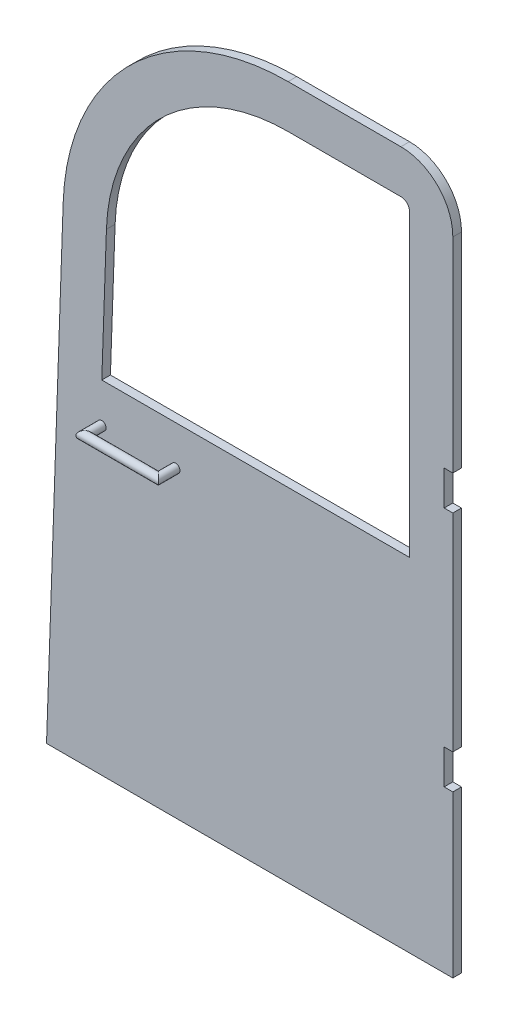
ISO-10303-21;
HEADER;
FILE_DESCRIPTION(('STEP AP214'),'2;1');
FILE_NAME('part.step','',(''),(''),'','','');
FILE_SCHEMA(('AUTOMOTIVE_DESIGN { 1 0 10303 214 1 1 1 1 }'));
ENDSEC;
DATA;
#1=APPLICATION_CONTEXT('core data for automotive mechanical design processes');
#2=APPLICATION_PROTOCOL_DEFINITION('international standard','automotive_design',2000,#1);
#3=PRODUCT_CONTEXT('',#1,'mechanical');
#4=PRODUCT('Part','Part','',(#3));
#5=PRODUCT_RELATED_PRODUCT_CATEGORY('part','',(#4));
#6=PRODUCT_DEFINITION_FORMATION('','',#4);
#7=PRODUCT_DEFINITION_CONTEXT('part definition',#1,'design');
#8=PRODUCT_DEFINITION('design','',#6,#7);
#9=PRODUCT_DEFINITION_SHAPE('','',#8);
#10=(LENGTH_UNIT() NAMED_UNIT(*) SI_UNIT(.MILLI.,.METRE.));
#11=(NAMED_UNIT(*) PLANE_ANGLE_UNIT() SI_UNIT($,.RADIAN.));
#12=(NAMED_UNIT(*) SI_UNIT($,.STERADIAN.) SOLID_ANGLE_UNIT());
#13=UNCERTAINTY_MEASURE_WITH_UNIT(LENGTH_MEASURE(1.E-05),#10,'distance_accuracy_value','');
#14=(GEOMETRIC_REPRESENTATION_CONTEXT(3) GLOBAL_UNCERTAINTY_ASSIGNED_CONTEXT((#13)) GLOBAL_UNIT_ASSIGNED_CONTEXT((#10,
#11,#12)) REPRESENTATION_CONTEXT('',''));
#15=CARTESIAN_POINT('',(0.,0.,0.));
#16=DIRECTION('',(0.,0.,1.));
#17=DIRECTION('',(1.,0.,0.));
#18=AXIS2_PLACEMENT_3D('',#15,#16,#17);
#19=CARTESIAN_POINT('',(873.874037659268,0.,25.4));
#20=DIRECTION('',(-1.,0.,0.));
#21=DIRECTION('',(0.,0.,1.));
#22=AXIS2_PLACEMENT_3D('',#19,#20,#21);
#23=PLANE('',#22);
#24=DIRECTION('',(0.,0.,1.));
#25=VECTOR('',#24,1.);
#26=CARTESIAN_POINT('',(873.874037659268,1181.70566534611,0.));
#27=LINE('',#26,#25);
#28=CARTESIAN_POINT('',(873.874037659268,1181.70566534611,0.));
#29=VERTEX_POINT('',#28);
#30=CARTESIAN_POINT('',(873.874037659268,1181.70566534611,25.4));
#31=VERTEX_POINT('',#30);
#32=EDGE_CURVE('E236',#29,#31,#27,.T.);
#33=ORIENTED_EDGE('',*,*,#32,.T.);
#34=DIRECTION('',(0.,1.,0.));
#35=VECTOR('',#34,1.);
#36=CARTESIAN_POINT('',(873.874037659268,0.,25.4));
#37=LINE('',#36,#35);
#38=CARTESIAN_POINT('',(873.874037659268,574.57159721076,25.4));
#39=VERTEX_POINT('',#38);
#40=EDGE_CURVE('E350',#39,#31,#37,.T.);
#41=ORIENTED_EDGE('',*,*,#40,.F.);
#42=DIRECTION('',(0.,0.,1.));
#43=VECTOR('',#42,1.);
#44=CARTESIAN_POINT('',(873.874037659268,574.57159721076,0.));
#45=LINE('',#44,#43);
#46=CARTESIAN_POINT('',(873.874037659268,574.57159721076,0.));
#47=VERTEX_POINT('',#46);
#48=EDGE_CURVE('E265',#47,#39,#45,.T.);
#49=ORIENTED_EDGE('',*,*,#48,.F.);
#50=DIRECTION('',(0.,1.,0.));
#51=VECTOR('',#50,1.);
#52=CARTESIAN_POINT('',(873.874037659268,0.,0.));
#53=LINE('',#52,#51);
#54=EDGE_CURVE('E371',#47,#29,#53,.T.);
#55=ORIENTED_EDGE('',*,*,#54,.T.);
#56=EDGE_LOOP('',(#33,#41,#49,#55));
#57=FACE_BOUND('',#56,.T.);
#58=ADVANCED_FACE('F51',(#57),#23,.F.);
#59=DIRECTION('',(0.,0.,1.));
#60=VECTOR('',#59,1.);
#61=CARTESIAN_POINT('',(873.874037659268,472.97159721076,0.));
#62=LINE('',#61,#60);
#63=CARTESIAN_POINT('',(873.874037659268,472.97159721076,0.));
#64=VERTEX_POINT('',#63);
#65=CARTESIAN_POINT('',(873.874037659268,472.97159721076,25.4));
#66=VERTEX_POINT('',#65);
#67=EDGE_CURVE('E268',#64,#66,#62,.T.);
#68=ORIENTED_EDGE('',*,*,#67,.T.);
#69=CARTESIAN_POINT('',(873.874037659268,0.,25.4));
#70=VERTEX_POINT('',#69);
#71=EDGE_CURVE('E345',#70,#66,#37,.T.);
#72=ORIENTED_EDGE('',*,*,#71,.F.);
#73=DIRECTION('',(0.,0.,-1.));
#74=VECTOR('',#73,1.);
#75=CARTESIAN_POINT('',(873.874037659268,0.,25.4));
#76=LINE('',#75,#74);
#77=CARTESIAN_POINT('',(873.874037659268,0.,0.));
#78=VERTEX_POINT('',#77);
#79=EDGE_CURVE('E394',#70,#78,#76,.T.);
#80=ORIENTED_EDGE('',*,*,#79,.T.);
#81=EDGE_CURVE('E366',#78,#64,#53,.T.);
#82=ORIENTED_EDGE('',*,*,#81,.T.);
#83=EDGE_LOOP('',(#68,#72,#80,#82));
#84=FACE_BOUND('',#83,.T.);
#85=ADVANCED_FACE('F418',(#84),#23,.F.);
#86=CARTESIAN_POINT('',(390.514635330888,1375.98215066507,25.4));
#87=DIRECTION('',(0.,0.,-1.));
#88=DIRECTION('',(-1.,0.,0.));
#89=AXIS2_PLACEMENT_3D('',#86,#87,#88);
#90=PLANE('',#89);
#91=CARTESIAN_POINT('',(-156.242870874206,889.,25.3999999999999));
#92=DIRECTION('',(0.,0.,-1.));
#93=DIRECTION('',(-1.,0.,0.));
#94=AXIS2_PLACEMENT_3D('',#91,#92,#93);
#95=CIRCLE('',#94,12.7);
#96=CARTESIAN_POINT('',(-168.942870874206,889.,25.3999999999999));
#97=VERTEX_POINT('',#96);
#98=EDGE_CURVE('E222',#97,#97,#95,.T.);
#99=ORIENTED_EDGE('',*,*,#98,.T.);
#100=EDGE_LOOP('',(#99));
#101=FACE_BOUND('',#100,.T.);
#102=CARTESIAN_POINT('',(60.4839734868648,889.,25.4000000000001));
#103=DIRECTION('',(0.,0.,1.));
#104=DIRECTION('',(1.,0.,0.));
#105=AXIS2_PLACEMENT_3D('',#102,#103,#104);
#106=CIRCLE('',#105,12.7);
#107=CARTESIAN_POINT('',(73.1839734868648,889.,25.4000000000001));
#108=VERTEX_POINT('',#107);
#109=EDGE_CURVE('E728',#108,#108,#106,.T.);
#110=ORIENTED_EDGE('',*,*,#109,.F.);
#111=EDGE_LOOP('',(#110));
#112=FACE_BOUND('',#111,.T.);
#113=DIRECTION('',(0.,-1.,0.));
#114=VECTOR('',#113,1.);
#115=CARTESIAN_POINT('',(848.474037659268,0.,25.4));
#116=LINE('',#115,#114);
#117=CARTESIAN_POINT('',(848.474037659268,1283.30566534611,25.4));
#118=VERTEX_POINT('',#117);
#119=CARTESIAN_POINT('',(848.474037659268,1181.70566534611,25.4));
#120=VERTEX_POINT('',#119);
#121=EDGE_CURVE('E219',#118,#120,#116,.T.);
#122=ORIENTED_EDGE('',*,*,#121,.F.);
#123=DIRECTION('',(-1.,0.,0.));
#124=VECTOR('',#123,1.);
#125=CARTESIAN_POINT('',(0.,1283.30566534611,25.4));
#126=LINE('',#125,#124);
#127=CARTESIAN_POINT('',(873.874037659268,1283.30566534611,25.4));
#128=VERTEX_POINT('',#127);
#129=EDGE_CURVE('E195',#128,#118,#126,.T.);
#130=ORIENTED_EDGE('',*,*,#129,.F.);
#131=CARTESIAN_POINT('',(873.874037659268,1883.156,25.4));
#132=VERTEX_POINT('',#131);
#133=EDGE_CURVE('E344',#128,#132,#37,.T.);
#134=ORIENTED_EDGE('',*,*,#133,.T.);
#135=CARTESIAN_POINT('',(721.476635330888,1884.04581096985,25.4));
#136=DIRECTION('',(0.,0.,1.));
#137=DIRECTION('',(1.,0.,0.));
#138=AXIS2_PLACEMENT_3D('',#135,#136,#137);
#139=CIRCLE('',#138,152.4);
#140=CARTESIAN_POINT('',(721.476635330888,2036.44581096985,25.4));
#141=VERTEX_POINT('',#140);
#142=EDGE_CURVE('E349',#132,#141,#139,.T.);
#143=ORIENTED_EDGE('',*,*,#142,.T.);
#144=DIRECTION('',(-1.,0.,0.));
#145=VECTOR('',#144,1.);
#146=CARTESIAN_POINT('',(721.476635330888,2036.44581096985,25.4));
#147=LINE('',#146,#145);
#148=CARTESIAN_POINT('',(390.514635330888,2036.44581096985,25.4));
#149=VERTEX_POINT('',#148);
#150=EDGE_CURVE('E353',#141,#149,#147,.T.);
#151=ORIENTED_EDGE('',*,*,#150,.T.);
#152=CARTESIAN_POINT('',(390.514635330888,1375.98215066507,25.4));
#153=DIRECTION('',(0.,0.,1.));
#154=DIRECTION('',(-1.,0.,0.));
#155=AXIS2_PLACEMENT_3D('',#152,#153,#154);
#156=CIRCLE('',#155,660.463660304774);
#157=CARTESIAN_POINT('',(-269.546688357159,1399.032,25.4));
#158=VERTEX_POINT('',#157);
#159=EDGE_CURVE('E356',#149,#158,#156,.T.);
#160=ORIENTED_EDGE('',*,*,#159,.T.);
#161=DIRECTION('',(-0.0348994967024969,-0.999390827019096,0.));
#162=VECTOR('',#161,1.);
#163=CARTESIAN_POINT('',(-318.401962340732,0.,25.4));
#164=LINE('',#163,#162);
#165=CARTESIAN_POINT('',(-318.401962340732,0.,25.4));
#166=VERTEX_POINT('',#165);
#167=EDGE_CURVE('E336',#158,#166,#164,.T.);
#168=ORIENTED_EDGE('',*,*,#167,.T.);
#169=DIRECTION('',(1.,0.,0.));
#170=VECTOR('',#169,1.);
#171=CARTESIAN_POINT('',(-318.401962340732,0.,25.4));
#172=LINE('',#171,#170);
#173=EDGE_CURVE('E340',#166,#70,#172,.T.);
#174=ORIENTED_EDGE('',*,*,#173,.T.);
#175=ORIENTED_EDGE('',*,*,#71,.T.);
#176=DIRECTION('',(-1.,0.,0.));
#177=VECTOR('',#176,1.);
#178=CARTESIAN_POINT('',(0.,472.97159721076,25.4));
#179=LINE('',#178,#177);
#180=CARTESIAN_POINT('',(848.474037659268,472.97159721076,25.4));
#181=VERTEX_POINT('',#180);
#182=EDGE_CURVE('E75',#66,#181,#179,.T.);
#183=ORIENTED_EDGE('',*,*,#182,.T.);
#184=DIRECTION('',(0.,1.,0.));
#185=VECTOR('',#184,1.);
#186=CARTESIAN_POINT('',(848.474037659268,0.,25.4));
#187=LINE('',#186,#185);
#188=CARTESIAN_POINT('',(848.474037659268,574.57159721076,25.4));
#189=VERTEX_POINT('',#188);
#190=EDGE_CURVE('E253',#181,#189,#187,.T.);
#191=ORIENTED_EDGE('',*,*,#190,.T.);
#192=DIRECTION('',(-1.,0.,0.));
#193=VECTOR('',#192,1.);
#194=CARTESIAN_POINT('',(0.,574.57159721076,25.4));
#195=LINE('',#194,#193);
#196=EDGE_CURVE('E245',#39,#189,#195,.T.);
#197=ORIENTED_EDGE('',*,*,#196,.F.);
#198=ORIENTED_EDGE('',*,*,#40,.T.);
#199=DIRECTION('',(-1.,0.,0.));
#200=VECTOR('',#199,1.);
#201=CARTESIAN_POINT('',(0.,1181.70566534611,25.4));
#202=LINE('',#201,#200);
#203=EDGE_CURVE('E67',#31,#120,#202,.T.);
#204=ORIENTED_EDGE('',*,*,#203,.T.);
#205=EDGE_LOOP('',(#122,#130,#134,#143,#151,#160,#168,#174,#175,#183,#191,#197,#198,#204));
#206=FACE_BOUND('',#205,.T.);
#207=CARTESIAN_POINT('',(390.514635330888,1375.98215066507,25.4));
#208=DIRECTION('',(0.,0.,1.));
#209=DIRECTION('',(-1.,0.,0.));
#210=AXIS2_PLACEMENT_3D('',#207,#208,#209);
#211=CIRCLE('',#210,533.463660304773);
#212=CARTESIAN_POINT('',(390.514635330888,1909.44581096985,25.4));
#213=VERTEX_POINT('',#212);
#214=CARTESIAN_POINT('',(-142.624053325734,1394.59976391878,25.4));
#215=VERTEX_POINT('',#214);
#216=EDGE_CURVE('E273',#213,#215,#211,.T.);
#217=ORIENTED_EDGE('',*,*,#216,.F.);
#218=DIRECTION('',(-1.,0.,0.));
#219=VECTOR('',#218,1.);
#220=CARTESIAN_POINT('',(721.476635330888,1909.44581096985,25.4));
#221=LINE('',#220,#219);
#222=CARTESIAN_POINT('',(721.476635330888,1909.44581096985,25.4));
#223=VERTEX_POINT('',#222);
#224=EDGE_CURVE('E290',#223,#213,#221,.T.);
#225=ORIENTED_EDGE('',*,*,#224,.F.);
#226=CARTESIAN_POINT('',(721.476635330888,1884.04581096985,25.4));
#227=DIRECTION('',(0.,0.,1.));
#228=DIRECTION('',(1.,0.,0.));
#229=AXIS2_PLACEMENT_3D('',#226,#227,#228);
#230=CIRCLE('',#229,25.4000000000003);
#231=CARTESIAN_POINT('',(746.874037659268,1883.68255490254,25.4));
#232=VERTEX_POINT('',#231);
#233=EDGE_CURVE('E286',#232,#223,#230,.T.);
#234=ORIENTED_EDGE('',*,*,#233,.F.);
#235=DIRECTION('',(0.,1.,0.));
#236=VECTOR('',#235,1.);
#237=CARTESIAN_POINT('',(746.874037659268,1005.34127745127,25.4));
#238=LINE('',#237,#236);
#239=CARTESIAN_POINT('',(746.874037659268,1005.34127745127,25.4));
#240=VERTEX_POINT('',#239);
#241=EDGE_CURVE('E283',#240,#232,#238,.T.);
#242=ORIENTED_EDGE('',*,*,#241,.F.);
#243=DIRECTION('',(0.999999670246038,0.000812100864935569,0.));
#244=VECTOR('',#243,1.);
#245=CARTESIAN_POINT('',(-156.242870874206,1004.60785518686,25.4));
#246=LINE('',#245,#244);
#247=CARTESIAN_POINT('',(-156.242870874206,1004.60785518686,25.4));
#248=VERTEX_POINT('',#247);
#249=EDGE_CURVE('E280',#248,#240,#246,.T.);
#250=ORIENTED_EDGE('',*,*,#249,.F.);
#251=DIRECTION('',(-0.0348994967024968,-0.999390827019096,0.));
#252=VECTOR('',#251,1.);
#253=CARTESIAN_POINT('',(-156.242870874206,1004.60785518686,25.4));
#254=LINE('',#253,#252);
#255=EDGE_CURVE('E276',#215,#248,#254,.T.);
#256=ORIENTED_EDGE('',*,*,#255,.F.);
#257=EDGE_LOOP('',(#217,#225,#234,#242,#250,#256));
#258=FACE_BOUND('',#257,.T.);
#259=ADVANCED_FACE('F409',(#101,#112,#206,#258),#90,.F.);
#260=CARTESIAN_POINT('',(390.514635330888,1375.98215066507,0.));
#261=DIRECTION('',(0.,0.,-1.));
#262=DIRECTION('',(-1.,0.,0.));
#263=AXIS2_PLACEMENT_3D('',#260,#261,#262);
#264=PLANE('',#263);
#265=CARTESIAN_POINT('',(60.4839734868648,889.,0.));
#266=DIRECTION('',(0.,0.,-1.));
#267=DIRECTION('',(-1.,0.,0.));
#268=AXIS2_PLACEMENT_3D('',#265,#266,#267);
#269=CIRCLE('',#268,12.7);
#270=CARTESIAN_POINT('',(47.7839734868648,889.,0.));
#271=VERTEX_POINT('',#270);
#272=EDGE_CURVE('E12',#271,#271,#269,.T.);
#273=ORIENTED_EDGE('',*,*,#272,.F.);
#274=EDGE_LOOP('',(#273));
#275=FACE_BOUND('',#274,.T.);
#276=CARTESIAN_POINT('',(-156.242870874206,889.,0.));
#277=DIRECTION('',(0.,0.,-1.));
#278=DIRECTION('',(-1.,0.,0.));
#279=AXIS2_PLACEMENT_3D('',#276,#277,#278);
#280=CIRCLE('',#279,12.7);
#281=CARTESIAN_POINT('',(-168.942870874206,889.,0.));
#282=VERTEX_POINT('',#281);
#283=EDGE_CURVE('E60',#282,#282,#280,.T.);
#284=ORIENTED_EDGE('',*,*,#283,.F.);
#285=EDGE_LOOP('',(#284));
#286=FACE_BOUND('',#285,.T.);
#287=DIRECTION('',(-1.,0.,0.));
#288=VECTOR('',#287,1.);
#289=CARTESIAN_POINT('',(0.,1283.30566534611,0.));
#290=LINE('',#289,#288);
#291=CARTESIAN_POINT('',(873.874037659268,1283.30566534611,0.));
#292=VERTEX_POINT('',#291);
#293=CARTESIAN_POINT('',(848.474037659268,1283.30566534611,0.));
#294=VERTEX_POINT('',#293);
#295=EDGE_CURVE('E192',#292,#294,#290,.T.);
#296=ORIENTED_EDGE('',*,*,#295,.T.);
#297=DIRECTION('',(0.,-1.,0.));
#298=VECTOR('',#297,1.);
#299=CARTESIAN_POINT('',(848.474037659268,0.,0.));
#300=LINE('',#299,#298);
#301=CARTESIAN_POINT('',(848.474037659268,1181.70566534611,0.));
#302=VERTEX_POINT('',#301);
#303=EDGE_CURVE('E205',#294,#302,#300,.T.);
#304=ORIENTED_EDGE('',*,*,#303,.T.);
#305=DIRECTION('',(-1.,0.,0.));
#306=VECTOR('',#305,1.);
#307=CARTESIAN_POINT('',(0.,1181.70566534611,0.));
#308=LINE('',#307,#306);
#309=EDGE_CURVE('E201',#29,#302,#308,.T.);
#310=ORIENTED_EDGE('',*,*,#309,.F.);
#311=ORIENTED_EDGE('',*,*,#54,.F.);
#312=DIRECTION('',(-1.,0.,0.));
#313=VECTOR('',#312,1.);
#314=CARTESIAN_POINT('',(0.,574.57159721076,0.));
#315=LINE('',#314,#313);
#316=CARTESIAN_POINT('',(848.474037659268,574.57159721076,0.));
#317=VERTEX_POINT('',#316);
#318=EDGE_CURVE('E248',#47,#317,#315,.T.);
#319=ORIENTED_EDGE('',*,*,#318,.T.);
#320=DIRECTION('',(0.,1.,0.));
#321=VECTOR('',#320,1.);
#322=CARTESIAN_POINT('',(848.474037659268,0.,0.));
#323=LINE('',#322,#321);
#324=CARTESIAN_POINT('',(848.474037659268,472.97159721076,0.));
#325=VERTEX_POINT('',#324);
#326=EDGE_CURVE('E241',#325,#317,#323,.T.);
#327=ORIENTED_EDGE('',*,*,#326,.F.);
#328=DIRECTION('',(-1.,0.,0.));
#329=VECTOR('',#328,1.);
#330=CARTESIAN_POINT('',(0.,472.97159721076,0.));
#331=LINE('',#330,#329);
#332=EDGE_CURVE('E244',#64,#325,#331,.T.);
#333=ORIENTED_EDGE('',*,*,#332,.F.);
#334=ORIENTED_EDGE('',*,*,#81,.F.);
#335=DIRECTION('',(1.,0.,0.));
#336=VECTOR('',#335,1.);
#337=CARTESIAN_POINT('',(-318.401962340732,0.,0.));
#338=LINE('',#337,#336);
#339=CARTESIAN_POINT('',(-318.401962340732,0.,0.));
#340=VERTEX_POINT('',#339);
#341=EDGE_CURVE('E363',#340,#78,#338,.T.);
#342=ORIENTED_EDGE('',*,*,#341,.F.);
#343=DIRECTION('',(-0.0348994967024969,-0.999390827019096,0.));
#344=VECTOR('',#343,1.);
#345=CARTESIAN_POINT('',(-318.401962340732,0.,0.));
#346=LINE('',#345,#344);
#347=CARTESIAN_POINT('',(-269.546688357159,1399.032,0.));
#348=VERTEX_POINT('',#347);
#349=EDGE_CURVE('E335',#348,#340,#346,.T.);
#350=ORIENTED_EDGE('',*,*,#349,.F.);
#351=CARTESIAN_POINT('',(390.514635330888,1375.98215066507,0.));
#352=DIRECTION('',(0.,0.,1.));
#353=DIRECTION('',(-1.,0.,0.));
#354=AXIS2_PLACEMENT_3D('',#351,#352,#353);
#355=CIRCLE('',#354,660.463660304774);
#356=CARTESIAN_POINT('',(390.514635330888,2036.44581096985,0.));
#357=VERTEX_POINT('',#356);
#358=EDGE_CURVE('E341',#357,#348,#355,.T.);
#359=ORIENTED_EDGE('',*,*,#358,.F.);
#360=DIRECTION('',(-1.,0.,0.));
#361=VECTOR('',#360,1.);
#362=CARTESIAN_POINT('',(721.476635330888,2036.44581096985,0.));
#363=LINE('',#362,#361);
#364=CARTESIAN_POINT('',(721.476635330888,2036.44581096985,0.));
#365=VERTEX_POINT('',#364);
#366=EDGE_CURVE('E374',#365,#357,#363,.T.);
#367=ORIENTED_EDGE('',*,*,#366,.F.);
#368=CARTESIAN_POINT('',(721.476635330888,1884.04581096985,0.));
#369=DIRECTION('',(0.,0.,1.));
#370=DIRECTION('',(1.,0.,0.));
#371=AXIS2_PLACEMENT_3D('',#368,#369,#370);
#372=CIRCLE('',#371,152.4);
#373=CARTESIAN_POINT('',(873.874037659268,1883.156,0.));
#374=VERTEX_POINT('',#373);
#375=EDGE_CURVE('E370',#374,#365,#372,.T.);
#376=ORIENTED_EDGE('',*,*,#375,.F.);
#377=EDGE_CURVE('E215',#292,#374,#53,.T.);
#378=ORIENTED_EDGE('',*,*,#377,.F.);
#379=EDGE_LOOP('',(#296,#304,#310,#311,#319,#327,#333,#334,#342,#350,#359,#367,#376,#378));
#380=FACE_BOUND('',#379,.T.);
#381=DIRECTION('',(-1.,0.,0.));
#382=VECTOR('',#381,1.);
#383=CARTESIAN_POINT('',(721.476635330888,1909.44581096985,0.));
#384=LINE('',#383,#382);
#385=CARTESIAN_POINT('',(721.476635330888,1909.44581096985,0.));
#386=VERTEX_POINT('',#385);
#387=CARTESIAN_POINT('',(390.514635330888,1909.44581096985,0.));
#388=VERTEX_POINT('',#387);
#389=EDGE_CURVE('E277',#386,#388,#384,.T.);
#390=ORIENTED_EDGE('',*,*,#389,.T.);
#391=CARTESIAN_POINT('',(390.514635330888,1375.98215066507,0.));
#392=DIRECTION('',(0.,0.,1.));
#393=DIRECTION('',(-1.,0.,0.));
#394=AXIS2_PLACEMENT_3D('',#391,#392,#393);
#395=CIRCLE('',#394,533.463660304773);
#396=CARTESIAN_POINT('',(-142.624053325734,1394.59976391878,0.));
#397=VERTEX_POINT('',#396);
#398=EDGE_CURVE('E235',#388,#397,#395,.T.);
#399=ORIENTED_EDGE('',*,*,#398,.T.);
#400=DIRECTION('',(-0.0348994967024968,-0.999390827019096,0.));
#401=VECTOR('',#400,1.);
#402=CARTESIAN_POINT('',(-156.242870874206,1004.60785518686,0.));
#403=LINE('',#402,#401);
#404=CARTESIAN_POINT('',(-156.242870874206,1004.60785518686,0.));
#405=VERTEX_POINT('',#404);
#406=EDGE_CURVE('E297',#397,#405,#403,.T.);
#407=ORIENTED_EDGE('',*,*,#406,.T.);
#408=DIRECTION('',(0.999999670246038,0.000812100864935569,0.));
#409=VECTOR('',#408,1.);
#410=CARTESIAN_POINT('',(-156.242870874206,1004.60785518686,0.));
#411=LINE('',#410,#409);
#412=CARTESIAN_POINT('',(746.874037659268,1005.34127745127,0.));
#413=VERTEX_POINT('',#412);
#414=EDGE_CURVE('E301',#405,#413,#411,.T.);
#415=ORIENTED_EDGE('',*,*,#414,.T.);
#416=DIRECTION('',(0.,1.,0.));
#417=VECTOR('',#416,1.);
#418=CARTESIAN_POINT('',(746.874037659268,1005.34127745127,0.));
#419=LINE('',#418,#417);
#420=CARTESIAN_POINT('',(746.874037659268,1883.68255490254,0.));
#421=VERTEX_POINT('',#420);
#422=EDGE_CURVE('E305',#413,#421,#419,.T.);
#423=ORIENTED_EDGE('',*,*,#422,.T.);
#424=CARTESIAN_POINT('',(721.476635330888,1884.04581096985,0.));
#425=DIRECTION('',(0.,0.,1.));
#426=DIRECTION('',(1.,0.,0.));
#427=AXIS2_PLACEMENT_3D('',#424,#425,#426);
#428=CIRCLE('',#427,25.4000000000003);
#429=EDGE_CURVE('E309',#421,#386,#428,.T.);
#430=ORIENTED_EDGE('',*,*,#429,.T.);
#431=EDGE_LOOP('',(#390,#399,#407,#415,#423,#430));
#432=FACE_BOUND('',#431,.T.);
#433=ADVANCED_FACE('F212',(#275,#286,#380,#432),#264,.T.);
#434=CARTESIAN_POINT('',(-318.401962340732,0.,25.4));
#435=DIRECTION('',(0.999390827019096,-0.0348994967024969,0.));
#436=DIRECTION('',(0.0348994967024969,0.999390827019096,0.));
#437=AXIS2_PLACEMENT_3D('',#434,#435,#436);
#438=PLANE('',#437);
#439=ORIENTED_EDGE('',*,*,#349,.T.);
#440=DIRECTION('',(0.,0.,-1.));
#441=VECTOR('',#440,1.);
#442=CARTESIAN_POINT('',(-318.401962340732,0.,25.4));
#443=LINE('',#442,#441);
#444=EDGE_CURVE('E398',#166,#340,#443,.T.);
#445=ORIENTED_EDGE('',*,*,#444,.F.);
#446=ORIENTED_EDGE('',*,*,#167,.F.);
#447=DIRECTION('',(0.,0.,-1.));
#448=VECTOR('',#447,1.);
#449=CARTESIAN_POINT('',(-269.546688357159,1399.032,25.4));
#450=LINE('',#449,#448);
#451=EDGE_CURVE('E359',#158,#348,#450,.T.);
#452=ORIENTED_EDGE('',*,*,#451,.T.);
#453=EDGE_LOOP('',(#439,#445,#446,#452));
#454=FACE_BOUND('',#453,.T.);
#455=ADVANCED_FACE('F53',(#454),#438,.F.);
#456=CARTESIAN_POINT('',(-318.401962340732,0.,25.4));
#457=DIRECTION('',(0.,1.,0.));
#458=DIRECTION('',(0.,0.,1.));
#459=AXIS2_PLACEMENT_3D('',#456,#457,#458);
#460=PLANE('',#459);
#461=ORIENTED_EDGE('',*,*,#341,.T.);
#462=ORIENTED_EDGE('',*,*,#79,.F.);
#463=ORIENTED_EDGE('',*,*,#173,.F.);
#464=ORIENTED_EDGE('',*,*,#444,.T.);
#465=EDGE_LOOP('',(#461,#462,#463,#464));
#466=FACE_BOUND('',#465,.T.);
#467=ADVANCED_FACE('F416',(#466),#460,.F.);
#468=ORIENTED_EDGE('',*,*,#133,.F.);
#469=DIRECTION('',(0.,0.,1.));
#470=VECTOR('',#469,1.);
#471=CARTESIAN_POINT('',(873.874037659268,1283.30566534611,0.));
#472=LINE('',#471,#470);
#473=EDGE_CURVE('E232',#292,#128,#472,.T.);
#474=ORIENTED_EDGE('',*,*,#473,.F.);
#475=ORIENTED_EDGE('',*,*,#377,.T.);
#476=DIRECTION('',(0.,0.,-1.));
#477=VECTOR('',#476,1.);
#478=CARTESIAN_POINT('',(873.874037659268,1883.156,25.4));
#479=LINE('',#478,#477);
#480=EDGE_CURVE('E390',#132,#374,#479,.T.);
#481=ORIENTED_EDGE('',*,*,#480,.F.);
#482=EDGE_LOOP('',(#468,#474,#475,#481));
#483=FACE_BOUND('',#482,.T.);
#484=ADVANCED_FACE('F426',(#483),#23,.F.);
#485=CARTESIAN_POINT('',(721.476635330888,1884.04581096985,25.4));
#486=DIRECTION('',(0.,0.,-1.));
#487=DIRECTION('',(-1.,0.,0.));
#488=AXIS2_PLACEMENT_3D('',#485,#486,#487);
#489=CYLINDRICAL_SURFACE('',#488,152.4);
#490=ORIENTED_EDGE('',*,*,#375,.T.);
#491=DIRECTION('',(0.,0.,-1.));
#492=VECTOR('',#491,1.);
#493=CARTESIAN_POINT('',(721.476635330888,2036.44581096985,25.4));
#494=LINE('',#493,#492);
#495=EDGE_CURVE('E386',#141,#365,#494,.T.);
#496=ORIENTED_EDGE('',*,*,#495,.F.);
#497=ORIENTED_EDGE('',*,*,#142,.F.);
#498=ORIENTED_EDGE('',*,*,#480,.T.);
#499=EDGE_LOOP('',(#490,#496,#497,#498));
#500=FACE_BOUND('',#499,.T.);
#501=ADVANCED_FACE('F433',(#500),#489,.T.);
#502=CARTESIAN_POINT('',(721.476635330888,2036.44581096985,25.4));
#503=DIRECTION('',(0.,-1.,0.));
#504=DIRECTION('',(0.,0.,-1.));
#505=AXIS2_PLACEMENT_3D('',#502,#503,#504);
#506=PLANE('',#505);
#507=ORIENTED_EDGE('',*,*,#366,.T.);
#508=DIRECTION('',(0.,0.,-1.));
#509=VECTOR('',#508,1.);
#510=CARTESIAN_POINT('',(390.514635330888,2036.44581096985,25.4));
#511=LINE('',#510,#509);
#512=EDGE_CURVE('E382',#149,#357,#511,.T.);
#513=ORIENTED_EDGE('',*,*,#512,.F.);
#514=ORIENTED_EDGE('',*,*,#150,.F.);
#515=ORIENTED_EDGE('',*,*,#495,.T.);
#516=EDGE_LOOP('',(#507,#513,#514,#515));
#517=FACE_BOUND('',#516,.T.);
#518=ADVANCED_FACE('F439',(#517),#506,.F.);
#519=CARTESIAN_POINT('',(390.514635330888,1375.98215066507,25.4));
#520=DIRECTION('',(0.,0.,-1.));
#521=DIRECTION('',(-1.,0.,0.));
#522=AXIS2_PLACEMENT_3D('',#519,#520,#521);
#523=CYLINDRICAL_SURFACE('',#522,660.463660304774);
#524=ORIENTED_EDGE('',*,*,#358,.T.);
#525=ORIENTED_EDGE('',*,*,#451,.F.);
#526=ORIENTED_EDGE('',*,*,#159,.F.);
#527=ORIENTED_EDGE('',*,*,#512,.T.);
#528=EDGE_LOOP('',(#524,#525,#526,#527));
#529=FACE_BOUND('',#528,.T.);
#530=ADVANCED_FACE('F468',(#529),#523,.T.);
#531=CARTESIAN_POINT('',(390.514635330888,1375.98215066507,25.4));
#532=DIRECTION('',(0.,0.,-1.));
#533=DIRECTION('',(-1.,0.,0.));
#534=AXIS2_PLACEMENT_3D('',#531,#532,#533);
#535=CYLINDRICAL_SURFACE('',#534,533.463660304773);
#536=ORIENTED_EDGE('',*,*,#398,.F.);
#537=DIRECTION('',(0.,0.,-1.));
#538=VECTOR('',#537,1.);
#539=CARTESIAN_POINT('',(390.514635330888,1909.44581096985,25.4));
#540=LINE('',#539,#538);
#541=EDGE_CURVE('E293',#213,#388,#540,.T.);
#542=ORIENTED_EDGE('',*,*,#541,.F.);
#543=ORIENTED_EDGE('',*,*,#216,.T.);
#544=DIRECTION('',(0.,0.,-1.));
#545=VECTOR('',#544,1.);
#546=CARTESIAN_POINT('',(-142.624053325734,1394.59976391878,25.4));
#547=LINE('',#546,#545);
#548=EDGE_CURVE('E331',#215,#397,#547,.T.);
#549=ORIENTED_EDGE('',*,*,#548,.T.);
#550=EDGE_LOOP('',(#536,#542,#543,#549));
#551=FACE_BOUND('',#550,.T.);
#552=ADVANCED_FACE('F513',(#551),#535,.F.);
#553=CARTESIAN_POINT('',(-156.242870874206,1004.60785518686,25.4));
#554=DIRECTION('',(0.999390827019096,-0.0348994967024968,0.));
#555=DIRECTION('',(0.0348994967024968,0.999390827019096,0.));
#556=AXIS2_PLACEMENT_3D('',#553,#554,#555);
#557=PLANE('',#556);
#558=ORIENTED_EDGE('',*,*,#406,.F.);
#559=ORIENTED_EDGE('',*,*,#548,.F.);
#560=ORIENTED_EDGE('',*,*,#255,.T.);
#561=DIRECTION('',(0.,0.,-1.));
#562=VECTOR('',#561,1.);
#563=CARTESIAN_POINT('',(-156.242870874206,1004.60785518686,25.4));
#564=LINE('',#563,#562);
#565=EDGE_CURVE('E328',#248,#405,#564,.T.);
#566=ORIENTED_EDGE('',*,*,#565,.T.);
#567=EDGE_LOOP('',(#558,#559,#560,#566));
#568=FACE_BOUND('',#567,.T.);
#569=ADVANCED_FACE('F509',(#568),#557,.T.);
#570=CARTESIAN_POINT('',(-156.242870874206,1004.60785518686,25.4));
#571=DIRECTION('',(-0.000812100864935569,0.999999670246038,0.));
#572=DIRECTION('',(-0.999999670246038,-0.000812100864935569,0.));
#573=AXIS2_PLACEMENT_3D('',#570,#571,#572);
#574=PLANE('',#573);
#575=ORIENTED_EDGE('',*,*,#414,.F.);
#576=ORIENTED_EDGE('',*,*,#565,.F.);
#577=ORIENTED_EDGE('',*,*,#249,.T.);
#578=DIRECTION('',(0.,0.,-1.));
#579=VECTOR('',#578,1.);
#580=CARTESIAN_POINT('',(746.874037659268,1005.34127745127,25.4));
#581=LINE('',#580,#579);
#582=EDGE_CURVE('E325',#240,#413,#581,.T.);
#583=ORIENTED_EDGE('',*,*,#582,.T.);
#584=EDGE_LOOP('',(#575,#576,#577,#583));
#585=FACE_BOUND('',#584,.T.);
#586=ADVANCED_FACE('F505',(#585),#574,.T.);
#587=CARTESIAN_POINT('',(746.874037659268,1005.34127745127,25.4));
#588=DIRECTION('',(-1.,0.,0.));
#589=DIRECTION('',(0.,0.,1.));
#590=AXIS2_PLACEMENT_3D('',#587,#588,#589);
#591=PLANE('',#590);
#592=ORIENTED_EDGE('',*,*,#422,.F.);
#593=ORIENTED_EDGE('',*,*,#582,.F.);
#594=ORIENTED_EDGE('',*,*,#241,.T.);
#595=DIRECTION('',(0.,0.,-1.));
#596=VECTOR('',#595,1.);
#597=CARTESIAN_POINT('',(746.874037659268,1883.68255490254,25.4));
#598=LINE('',#597,#596);
#599=EDGE_CURVE('E322',#232,#421,#598,.T.);
#600=ORIENTED_EDGE('',*,*,#599,.T.);
#601=EDGE_LOOP('',(#592,#593,#594,#600));
#602=FACE_BOUND('',#601,.T.);
#603=ADVANCED_FACE('F501',(#602),#591,.T.);
#604=CARTESIAN_POINT('',(721.476635330888,1884.04581096985,25.4));
#605=DIRECTION('',(0.,0.,-1.));
#606=DIRECTION('',(-1.,0.,0.));
#607=AXIS2_PLACEMENT_3D('',#604,#605,#606);
#608=CYLINDRICAL_SURFACE('',#607,25.4000000000003);
#609=ORIENTED_EDGE('',*,*,#429,.F.);
#610=ORIENTED_EDGE('',*,*,#599,.F.);
#611=ORIENTED_EDGE('',*,*,#233,.T.);
#612=DIRECTION('',(0.,0.,-1.));
#613=VECTOR('',#612,1.);
#614=CARTESIAN_POINT('',(721.476635330888,1909.44581096985,25.4));
#615=LINE('',#614,#613);
#616=EDGE_CURVE('E319',#223,#386,#615,.T.);
#617=ORIENTED_EDGE('',*,*,#616,.T.);
#618=EDGE_LOOP('',(#609,#610,#611,#617));
#619=FACE_BOUND('',#618,.T.);
#620=ADVANCED_FACE('F497',(#619),#608,.F.);
#621=CARTESIAN_POINT('',(721.476635330888,1909.44581096985,25.4));
#622=DIRECTION('',(0.,-1.,0.));
#623=DIRECTION('',(1.,0.,0.));
#624=AXIS2_PLACEMENT_3D('',#621,#622,#623);
#625=PLANE('',#624);
#626=ORIENTED_EDGE('',*,*,#389,.F.);
#627=ORIENTED_EDGE('',*,*,#616,.F.);
#628=ORIENTED_EDGE('',*,*,#224,.T.);
#629=ORIENTED_EDGE('',*,*,#541,.T.);
#630=EDGE_LOOP('',(#626,#627,#628,#629));
#631=FACE_BOUND('',#630,.T.);
#632=ADVANCED_FACE('F490',(#631),#625,.T.);
#633=CARTESIAN_POINT('',(848.474037659268,0.,0.));
#634=DIRECTION('',(1.,0.,0.));
#635=DIRECTION('',(0.,0.,-1.));
#636=AXIS2_PLACEMENT_3D('',#633,#634,#635);
#637=PLANE('',#636);
#638=ORIENTED_EDGE('',*,*,#190,.F.);
#639=DIRECTION('',(0.,0.,1.));
#640=VECTOR('',#639,1.);
#641=CARTESIAN_POINT('',(848.474037659268,472.97159721076,0.));
#642=LINE('',#641,#640);
#643=EDGE_CURVE('E252',#325,#181,#642,.T.);
#644=ORIENTED_EDGE('',*,*,#643,.F.);
#645=ORIENTED_EDGE('',*,*,#326,.T.);
#646=DIRECTION('',(0.,0.,1.));
#647=VECTOR('',#646,1.);
#648=CARTESIAN_POINT('',(848.474037659268,574.57159721076,0.));
#649=LINE('',#648,#647);
#650=EDGE_CURVE('E229',#317,#189,#649,.T.);
#651=ORIENTED_EDGE('',*,*,#650,.T.);
#652=EDGE_LOOP('',(#638,#644,#645,#651));
#653=FACE_BOUND('',#652,.T.);
#654=ADVANCED_FACE('F478',(#653),#637,.T.);
#655=CARTESIAN_POINT('',(0.,574.57159721076,0.));
#656=DIRECTION('',(0.,1.,0.));
#657=DIRECTION('',(0.,0.,1.));
#658=AXIS2_PLACEMENT_3D('',#655,#656,#657);
#659=PLANE('',#658);
#660=ORIENTED_EDGE('',*,*,#196,.T.);
#661=ORIENTED_EDGE('',*,*,#650,.F.);
#662=ORIENTED_EDGE('',*,*,#318,.F.);
#663=ORIENTED_EDGE('',*,*,#48,.T.);
#664=EDGE_LOOP('',(#660,#661,#662,#663));
#665=FACE_BOUND('',#664,.T.);
#666=ADVANCED_FACE('F481',(#665),#659,.F.);
#667=CARTESIAN_POINT('',(0.,472.97159721076,0.));
#668=DIRECTION('',(0.,1.,0.));
#669=DIRECTION('',(0.,0.,1.));
#670=AXIS2_PLACEMENT_3D('',#667,#668,#669);
#671=PLANE('',#670);
#672=ORIENTED_EDGE('',*,*,#182,.F.);
#673=ORIENTED_EDGE('',*,*,#67,.F.);
#674=ORIENTED_EDGE('',*,*,#332,.T.);
#675=ORIENTED_EDGE('',*,*,#643,.T.);
#676=EDGE_LOOP('',(#672,#673,#674,#675));
#677=FACE_BOUND('',#676,.T.);
#678=ADVANCED_FACE('F483',(#677),#671,.T.);
#679=CARTESIAN_POINT('',(0.,1283.30566534611,0.));
#680=DIRECTION('',(0.,1.,0.));
#681=DIRECTION('',(0.,0.,1.));
#682=AXIS2_PLACEMENT_3D('',#679,#680,#681);
#683=PLANE('',#682);
#684=ORIENTED_EDGE('',*,*,#129,.T.);
#685=DIRECTION('',(0.,0.,1.));
#686=VECTOR('',#685,1.);
#687=CARTESIAN_POINT('',(848.474037659268,1283.30566534611,0.));
#688=LINE('',#687,#686);
#689=EDGE_CURVE('E188',#294,#118,#688,.T.);
#690=ORIENTED_EDGE('',*,*,#689,.F.);
#691=ORIENTED_EDGE('',*,*,#295,.F.);
#692=ORIENTED_EDGE('',*,*,#473,.T.);
#693=EDGE_LOOP('',(#684,#690,#691,#692));
#694=FACE_BOUND('',#693,.T.);
#695=ADVANCED_FACE('F190',(#694),#683,.F.);
#696=CARTESIAN_POINT('',(0.,1181.70566534611,0.));
#697=DIRECTION('',(0.,1.,0.));
#698=DIRECTION('',(0.,0.,1.));
#699=AXIS2_PLACEMENT_3D('',#696,#697,#698);
#700=PLANE('',#699);
#701=ORIENTED_EDGE('',*,*,#203,.F.);
#702=ORIENTED_EDGE('',*,*,#32,.F.);
#703=ORIENTED_EDGE('',*,*,#309,.T.);
#704=DIRECTION('',(0.,0.,1.));
#705=VECTOR('',#704,1.);
#706=CARTESIAN_POINT('',(848.474037659268,1181.70566534611,0.));
#707=LINE('',#706,#705);
#708=EDGE_CURVE('E200',#302,#120,#707,.T.);
#709=ORIENTED_EDGE('',*,*,#708,.T.);
#710=EDGE_LOOP('',(#701,#702,#703,#709));
#711=FACE_BOUND('',#710,.T.);
#712=ADVANCED_FACE('F455',(#711),#700,.T.);
#713=CARTESIAN_POINT('',(848.474037659268,0.,0.));
#714=DIRECTION('',(-1.,0.,0.));
#715=DIRECTION('',(0.,0.,1.));
#716=AXIS2_PLACEMENT_3D('',#713,#714,#715);
#717=PLANE('',#716);
#718=ORIENTED_EDGE('',*,*,#121,.T.);
#719=ORIENTED_EDGE('',*,*,#708,.F.);
#720=ORIENTED_EDGE('',*,*,#303,.F.);
#721=ORIENTED_EDGE('',*,*,#689,.T.);
#722=EDGE_LOOP('',(#718,#719,#720,#721));
#723=FACE_BOUND('',#722,.T.);
#724=ADVANCED_FACE('F206',(#723),#717,.F.);
#725=CARTESIAN_POINT('',(60.4839734868648,889.,-64.87));
#726=DIRECTION('',(0.,0.,1.));
#727=DIRECTION('',(1.,0.,0.));
#728=AXIS2_PLACEMENT_3D('',#725,#726,#727);
#729=CYLINDRICAL_SURFACE('',#728,12.7);
#730=CARTESIAN_POINT('',(60.4839734868648,889.,-50.8));
#731=DIRECTION('',(0.707106781186547,0.,0.707106781186547));
#732=DIRECTION('',(0.707106781186548,0.,-0.707106781186548));
#733=AXIS2_PLACEMENT_3D('',#730,#731,#732);
#734=ELLIPSE('',#733,17.9605122421383,12.7);
#735=CARTESIAN_POINT('',(73.1839734868648,889.,-63.5));
#736=VERTEX_POINT('',#735);
#737=EDGE_CURVE('E726',#736,#736,#734,.F.);
#738=ORIENTED_EDGE('',*,*,#737,.F.);
#739=EDGE_LOOP('',(#738));
#740=FACE_BOUND('',#739,.T.);
#741=ORIENTED_EDGE('',*,*,#272,.T.);
#742=EDGE_LOOP('',(#741));
#743=FACE_BOUND('',#742,.T.);
#744=ADVANCED_FACE('F578',(#740,#743),#729,.T.);
#745=CARTESIAN_POINT('',(-170.312870874206,889.,-50.8));
#746=DIRECTION('',(1.,0.,0.));
#747=DIRECTION('',(0.,0.,-1.));
#748=AXIS2_PLACEMENT_3D('',#745,#746,#747);
#749=CYLINDRICAL_SURFACE('',#748,12.7);
#750=CARTESIAN_POINT('',(-156.242870874206,889.,-50.8));
#751=DIRECTION('',(0.707106781186547,0.,-0.707106781186547));
#752=DIRECTION('',(-0.707106781186548,0.,-0.707106781186548));
#753=AXIS2_PLACEMENT_3D('',#750,#751,#752);
#754=ELLIPSE('',#753,17.9605122421383,12.7);
#755=CARTESIAN_POINT('',(-168.942870874206,889.,-63.5));
#756=VERTEX_POINT('',#755);
#757=EDGE_CURVE('E257',#756,#756,#754,.F.);
#758=ORIENTED_EDGE('',*,*,#757,.F.);
#759=EDGE_LOOP('',(#758));
#760=FACE_BOUND('',#759,.T.);
#761=ORIENTED_EDGE('',*,*,#737,.T.);
#762=EDGE_LOOP('',(#761));
#763=FACE_BOUND('',#762,.T.);
#764=ADVANCED_FACE('F681',(#760,#763),#749,.T.);
#765=CARTESIAN_POINT('',(-156.242870874206,889.,0.));
#766=DIRECTION('',(0.,0.,-1.));
#767=DIRECTION('',(-1.,0.,0.));
#768=AXIS2_PLACEMENT_3D('',#765,#766,#767);
#769=CYLINDRICAL_SURFACE('',#768,12.7);
#770=ORIENTED_EDGE('',*,*,#283,.T.);
#771=EDGE_LOOP('',(#770));
#772=FACE_BOUND('',#771,.T.);
#773=ORIENTED_EDGE('',*,*,#757,.T.);
#774=EDGE_LOOP('',(#773));
#775=FACE_BOUND('',#774,.T.);
#776=ADVANCED_FACE('F405',(#772,#775),#769,.T.);
#777=CARTESIAN_POINT('',(-156.242870874206,889.,90.27));
#778=DIRECTION('',(0.,0.,-1.));
#779=DIRECTION('',(-1.,0.,0.));
#780=AXIS2_PLACEMENT_3D('',#777,#778,#779);
#781=CYLINDRICAL_SURFACE('',#780,12.7);
#782=CARTESIAN_POINT('',(-156.242870874206,889.,76.2));
#783=DIRECTION('',(-0.707106781186547,0.,-0.707106781186547));
#784=DIRECTION('',(-0.707106781186548,0.,0.707106781186548));
#785=AXIS2_PLACEMENT_3D('',#782,#783,#784);
#786=ELLIPSE('',#785,17.9605122421383,12.7);
#787=CARTESIAN_POINT('',(-168.942870874206,889.,88.9));
#788=VERTEX_POINT('',#787);
#789=EDGE_CURVE('E739',#788,#788,#786,.F.);
#790=ORIENTED_EDGE('',*,*,#789,.F.);
#791=EDGE_LOOP('',(#790));
#792=FACE_BOUND('',#791,.T.);
#793=ORIENTED_EDGE('',*,*,#98,.F.);
#794=EDGE_LOOP('',(#793));
#795=FACE_BOUND('',#794,.T.);
#796=ADVANCED_FACE('F668',(#792,#795),#781,.T.);
#797=CARTESIAN_POINT('',(74.5539734868648,889.,76.2));
#798=DIRECTION('',(-1.,0.,0.));
#799=DIRECTION('',(0.,0.,1.));
#800=AXIS2_PLACEMENT_3D('',#797,#798,#799);
#801=CYLINDRICAL_SURFACE('',#800,12.7);
#802=CARTESIAN_POINT('',(60.4839734868648,889.,76.2));
#803=DIRECTION('',(-0.707106781186547,0.,0.707106781186547));
#804=DIRECTION('',(0.707106781186548,0.,0.707106781186548));
#805=AXIS2_PLACEMENT_3D('',#802,#803,#804);
#806=ELLIPSE('',#805,17.9605122421383,12.7);
#807=CARTESIAN_POINT('',(73.1839734868648,889.,88.9));
#808=VERTEX_POINT('',#807);
#809=EDGE_CURVE('E734',#808,#808,#806,.F.);
#810=ORIENTED_EDGE('',*,*,#809,.F.);
#811=EDGE_LOOP('',(#810));
#812=FACE_BOUND('',#811,.T.);
#813=ORIENTED_EDGE('',*,*,#789,.T.);
#814=EDGE_LOOP('',(#813));
#815=FACE_BOUND('',#814,.T.);
#816=ADVANCED_FACE('F671',(#812,#815),#801,.T.);
#817=CARTESIAN_POINT('',(60.4839734868648,889.,25.4000000000001));
#818=DIRECTION('',(0.,0.,1.));
#819=DIRECTION('',(1.,0.,0.));
#820=AXIS2_PLACEMENT_3D('',#817,#818,#819);
#821=CYLINDRICAL_SURFACE('',#820,12.7);
#822=ORIENTED_EDGE('',*,*,#109,.T.);
#823=EDGE_LOOP('',(#822));
#824=FACE_BOUND('',#823,.T.);
#825=ORIENTED_EDGE('',*,*,#809,.T.);
#826=EDGE_LOOP('',(#825));
#827=FACE_BOUND('',#826,.T.);
#828=ADVANCED_FACE('F675',(#824,#827),#821,.T.);
#829=CLOSED_SHELL('',(#58,#85,#259,#433,#455,#467,#484,#501,#518,#530,#552,#569,#586,#603,#620,
#632,#654,#666,#678,#695,#712,#724,#744,#764,#776,#796,#816,#828));
#830=MANIFOLD_SOLID_BREP('B2',#829);
#831=ADVANCED_BREP_SHAPE_REPRESENTATION('',(#18,#830),#14);
#832=SHAPE_DEFINITION_REPRESENTATION(#9,#831);
ENDSEC;
END-ISO-10303-21;
